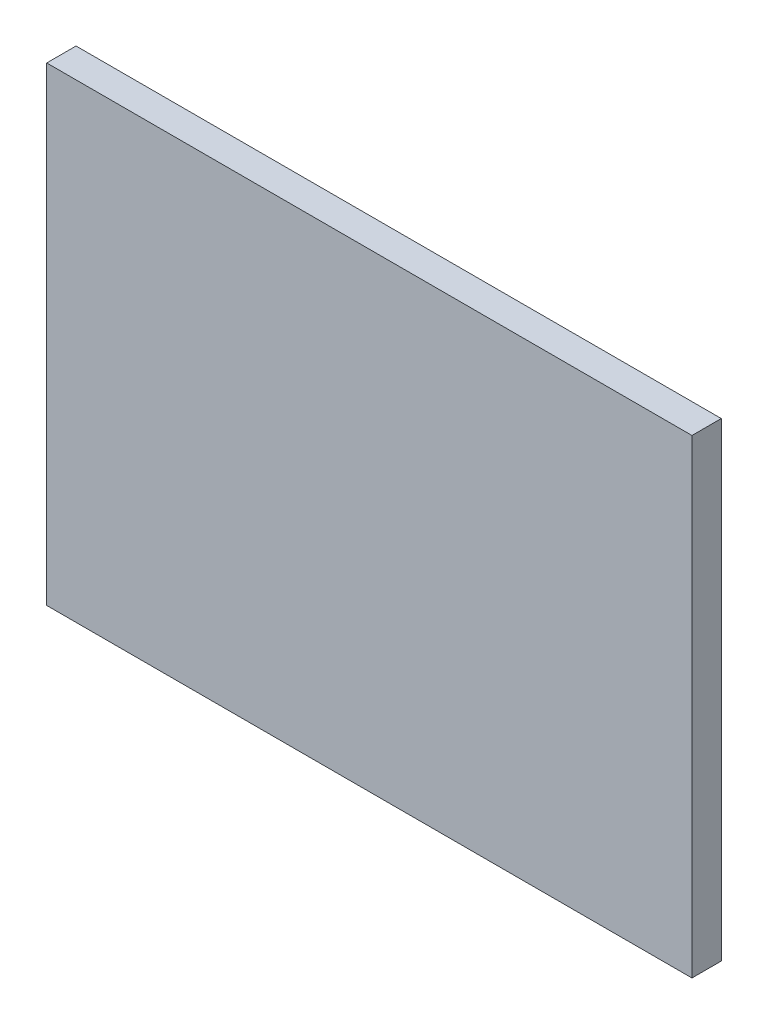
ISO-10303-21;
HEADER;
FILE_DESCRIPTION(('STEP AP214'),'2;1');
FILE_NAME('part.step','',(''),(''),'','','');
FILE_SCHEMA(('AUTOMOTIVE_DESIGN { 1 0 10303 214 1 1 1 1 }'));
ENDSEC;
DATA;
#1=APPLICATION_CONTEXT('core data for automotive mechanical design processes');
#2=APPLICATION_PROTOCOL_DEFINITION('international standard','automotive_design',2000,#1);
#3=PRODUCT_CONTEXT('',#1,'mechanical');
#4=PRODUCT('Part','Part','',(#3));
#5=PRODUCT_RELATED_PRODUCT_CATEGORY('part','',(#4));
#6=PRODUCT_DEFINITION_FORMATION('','',#4);
#7=PRODUCT_DEFINITION_CONTEXT('part definition',#1,'design');
#8=PRODUCT_DEFINITION('design','',#6,#7);
#9=PRODUCT_DEFINITION_SHAPE('','',#8);
#10=(LENGTH_UNIT() NAMED_UNIT(*) SI_UNIT(.MILLI.,.METRE.));
#11=(NAMED_UNIT(*) PLANE_ANGLE_UNIT() SI_UNIT($,.RADIAN.));
#12=(NAMED_UNIT(*) SI_UNIT($,.STERADIAN.) SOLID_ANGLE_UNIT());
#13=UNCERTAINTY_MEASURE_WITH_UNIT(LENGTH_MEASURE(1.E-05),#10,'distance_accuracy_value','');
#14=(GEOMETRIC_REPRESENTATION_CONTEXT(3) GLOBAL_UNCERTAINTY_ASSIGNED_CONTEXT((#13)) GLOBAL_UNIT_ASSIGNED_CONTEXT((#10,
#11,#12)) REPRESENTATION_CONTEXT('',''));
#15=CARTESIAN_POINT('',(0.,0.,0.));
#16=DIRECTION('',(0.,0.,1.));
#17=DIRECTION('',(1.,0.,0.));
#18=AXIS2_PLACEMENT_3D('',#15,#16,#17);
#19=CARTESIAN_POINT('',(13.000006969395,-8.00000066,0.835272852862));
#20=DIRECTION('',(0.,0.,1.));
#21=DIRECTION('',(1.,0.,0.));
#22=AXIS2_PLACEMENT_3D('',#19,#20,#21);
#23=PLANE('',#22);
#24=DIRECTION('',(0.,1.,0.));
#25=VECTOR('',#24,1.);
#26=CARTESIAN_POINT('',(11.900006899369,-8.00000066,0.835272852862));
#27=LINE('',#26,#25);
#28=CARTESIAN_POINT('',(11.900006899369,-7.19900066000003,0.835272852862));
#29=VERTEX_POINT('',#28);
#30=CARTESIAN_POINT('',(11.9000069693946,-8.801000756165,0.835272852862));
#31=VERTEX_POINT('',#30);
#32=EDGE_CURVE('E20',#29,#31,#27,.F.);
#33=ORIENTED_EDGE('',*,*,#32,.F.);
#34=DIRECTION('',(-0.999999999999996,-8.74227765734797E-08,0.));
#35=VECTOR('',#34,1.);
#36=CARTESIAN_POINT('',(14.100006899369,-7.199000563835,0.835272852862));
#37=LINE('',#36,#35);
#38=CARTESIAN_POINT('',(14.1000069693944,-7.199000563835,0.835272852862));
#39=VERTEX_POINT('',#38);
#40=EDGE_CURVE('E55',#39,#29,#37,.T.);
#41=ORIENTED_EDGE('',*,*,#40,.F.);
#42=DIRECTION('',(-8.74227765734797E-08,0.999999999999996,0.));
#43=VECTOR('',#42,1.);
#44=CARTESIAN_POINT('',(14.10000703942,-8.801000563835,0.835272852862));
#45=LINE('',#44,#43);
#46=CARTESIAN_POINT('',(14.10000703942,-8.80100065999997,0.835272852862));
#47=VERTEX_POINT('',#46);
#48=EDGE_CURVE('E58',#47,#39,#45,.T.);
#49=ORIENTED_EDGE('',*,*,#48,.F.);
#50=DIRECTION('',(0.999999999999996,8.74227765734797E-08,0.));
#51=VECTOR('',#50,1.);
#52=CARTESIAN_POINT('',(11.90000703942,-8.801000756165,0.835272852862));
#53=LINE('',#52,#51);
#54=EDGE_CURVE('E60',#31,#47,#53,.T.);
#55=ORIENTED_EDGE('',*,*,#54,.F.);
#56=EDGE_LOOP('',(#33,#41,#49,#55));
#57=FACE_BOUND('',#56,.T.);
#58=ADVANCED_FACE('F17',(#57),#23,.F.);
#59=CARTESIAN_POINT('',(11.90000703942,-8.801000756165,0.835272852862));
#60=DIRECTION('',(8.74227765734797E-08,-0.999999999999996,0.));
#61=DIRECTION('',(0.999999999999996,8.74227765734797E-08,0.));
#62=AXIS2_PLACEMENT_3D('',#59,#60,#61);
#63=PLANE('',#62);
#64=DIRECTION('',(1.,0.,0.));
#65=VECTOR('',#64,1.);
#66=CARTESIAN_POINT('',(13.000006969395,-8.801000756165,0.935272852862));
#67=LINE('',#66,#65);
#68=CARTESIAN_POINT('',(11.9000070044073,-8.801000756165,0.935272852862));
#69=VERTEX_POINT('',#68);
#70=CARTESIAN_POINT('',(14.10000703942,-8.80100061191745,0.935272852862));
#71=VERTEX_POINT('',#70);
#72=EDGE_CURVE('E83',#69,#71,#67,.T.);
#73=ORIENTED_EDGE('',*,*,#72,.F.);
#74=DIRECTION('',(0.,0.,1.));
#75=VECTOR('',#74,1.);
#76=CARTESIAN_POINT('',(11.9000070394203,-8.801000756165,0.835272852862));
#77=LINE('',#76,#75);
#78=EDGE_CURVE('E71',#31,#69,#77,.T.);
#79=ORIENTED_EDGE('',*,*,#78,.F.);
#80=ORIENTED_EDGE('',*,*,#54,.T.);
#81=DIRECTION('',(0.,0.,1.));
#82=VECTOR('',#81,1.);
#83=CARTESIAN_POINT('',(14.10000703942,-8.801000563835,0.835272852862));
#84=LINE('',#83,#82);
#85=EDGE_CURVE('E65',#71,#47,#84,.F.);
#86=ORIENTED_EDGE('',*,*,#85,.F.);
#87=EDGE_LOOP('',(#73,#79,#80,#86));
#88=FACE_BOUND('',#87,.T.);
#89=ADVANCED_FACE('F68',(#88),#63,.T.);
#90=CARTESIAN_POINT('',(14.10000703942,-8.801000563835,0.835272852862));
#91=DIRECTION('',(0.999999999999996,8.74227765734797E-08,0.));
#92=DIRECTION('',(-8.74227765734797E-08,0.999999999999996,0.));
#93=AXIS2_PLACEMENT_3D('',#90,#91,#92);
#94=PLANE('',#93);
#95=DIRECTION('',(0.,1.,0.));
#96=VECTOR('',#95,1.);
#97=CARTESIAN_POINT('',(14.10000703942,-8.00000066,0.935272852862));
#98=LINE('',#97,#96);
#99=CARTESIAN_POINT('',(14.1000069343816,-7.199000563835,0.935272852862));
#100=VERTEX_POINT('',#99);
#101=EDGE_CURVE('E74',#71,#100,#98,.T.);
#102=ORIENTED_EDGE('',*,*,#101,.F.);
#103=ORIENTED_EDGE('',*,*,#85,.T.);
#104=ORIENTED_EDGE('',*,*,#48,.T.);
#105=DIRECTION('',(0.,0.,1.));
#106=VECTOR('',#105,1.);
#107=CARTESIAN_POINT('',(14.100006899369,-7.199000563835,0.835272852862));
#108=LINE('',#107,#106);
#109=EDGE_CURVE('E77',#100,#39,#108,.F.);
#110=ORIENTED_EDGE('',*,*,#109,.F.);
#111=EDGE_LOOP('',(#102,#103,#104,#110));
#112=FACE_BOUND('',#111,.T.);
#113=ADVANCED_FACE('F72',(#112),#94,.T.);
#114=CARTESIAN_POINT('',(14.100006899369,-7.199000563835,0.835272852862));
#115=DIRECTION('',(-8.74227765734797E-08,0.999999999999996,0.));
#116=DIRECTION('',(-0.999999999999996,-8.74227765734797E-08,0.));
#117=AXIS2_PLACEMENT_3D('',#114,#115,#116);
#118=PLANE('',#117);
#119=DIRECTION('',(1.,0.,0.));
#120=VECTOR('',#119,1.);
#121=CARTESIAN_POINT('',(13.000006969395,-7.199000563835,0.935272852862));
#122=LINE('',#121,#120);
#123=CARTESIAN_POINT('',(11.900006899369,-7.19900070808255,0.935272852862));
#124=VERTEX_POINT('',#123);
#125=EDGE_CURVE('E26',#100,#124,#122,.F.);
#126=ORIENTED_EDGE('',*,*,#125,.F.);
#127=ORIENTED_EDGE('',*,*,#109,.T.);
#128=ORIENTED_EDGE('',*,*,#40,.T.);
#129=DIRECTION('',(0.,0.,1.));
#130=VECTOR('',#129,1.);
#131=CARTESIAN_POINT('',(11.900006899369,-7.199000756165,0.835272852862));
#132=LINE('',#131,#130);
#133=EDGE_CURVE('E35',#124,#29,#132,.F.);
#134=ORIENTED_EDGE('',*,*,#133,.F.);
#135=EDGE_LOOP('',(#126,#127,#128,#134));
#136=FACE_BOUND('',#135,.T.);
#137=ADVANCED_FACE('F89',(#136),#118,.T.);
#138=CARTESIAN_POINT('',(11.900006899369,-7.199000756165,0.835272852862));
#139=DIRECTION('',(-0.999999999999996,-8.74227765734797E-08,0.));
#140=DIRECTION('',(8.74227765734797E-08,-0.999999999999996,0.));
#141=AXIS2_PLACEMENT_3D('',#138,#139,#140);
#142=PLANE('',#141);
#143=DIRECTION('',(0.,1.,0.));
#144=VECTOR('',#143,1.);
#145=CARTESIAN_POINT('',(11.900006899369,-8.00000066,0.935272852862));
#146=LINE('',#145,#144);
#147=EDGE_CURVE('E11',#124,#69,#146,.F.);
#148=ORIENTED_EDGE('',*,*,#147,.F.);
#149=ORIENTED_EDGE('',*,*,#133,.T.);
#150=ORIENTED_EDGE('',*,*,#32,.T.);
#151=ORIENTED_EDGE('',*,*,#78,.T.);
#152=EDGE_LOOP('',(#148,#149,#150,#151));
#153=FACE_BOUND('',#152,.T.);
#154=ADVANCED_FACE('F91',(#153),#142,.T.);
#155=CARTESIAN_POINT('',(13.000006969395,-8.00000066,0.935272852862));
#156=DIRECTION('',(0.,0.,1.));
#157=DIRECTION('',(1.,0.,0.));
#158=AXIS2_PLACEMENT_3D('',#155,#156,#157);
#159=PLANE('',#158);
#160=ORIENTED_EDGE('',*,*,#125,.T.);
#161=ORIENTED_EDGE('',*,*,#147,.T.);
#162=ORIENTED_EDGE('',*,*,#72,.T.);
#163=ORIENTED_EDGE('',*,*,#101,.T.);
#164=EDGE_LOOP('',(#160,#161,#162,#163));
#165=FACE_BOUND('',#164,.T.);
#166=ADVANCED_FACE('F88',(#165),#159,.T.);
#167=CLOSED_SHELL('',(#58,#89,#113,#137,#154,#166));
#168=MANIFOLD_SOLID_BREP('B1',#167);
#169=ADVANCED_BREP_SHAPE_REPRESENTATION('',(#18,#168),#14);
#170=SHAPE_DEFINITION_REPRESENTATION(#9,#169);
ENDSEC;
END-ISO-10303-21;
